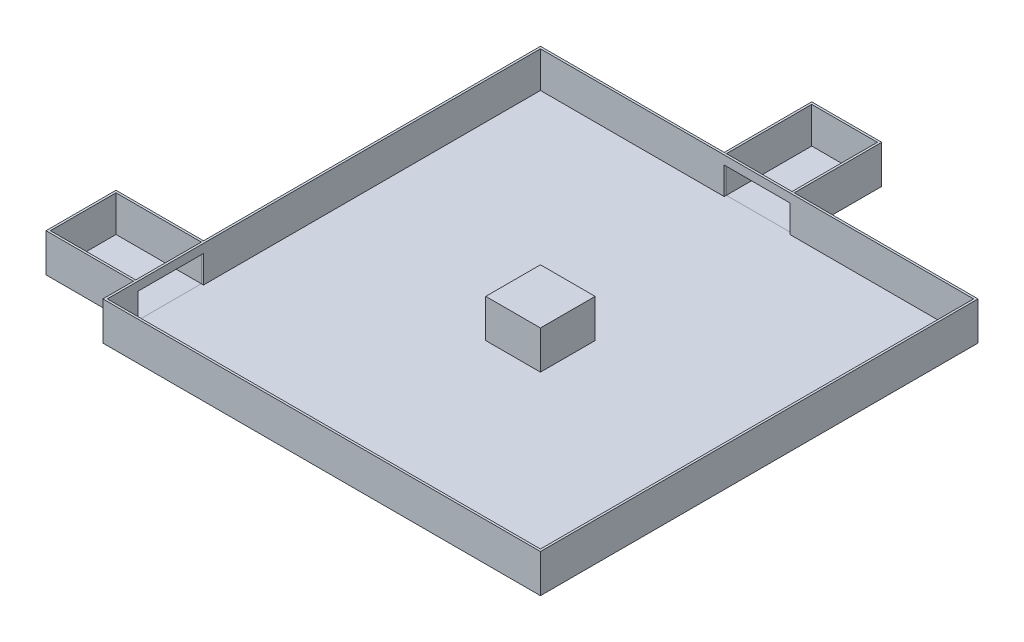
ISO-10303-21;
HEADER;
FILE_DESCRIPTION(('STEP AP214'),'2;1');
FILE_NAME('part.step','',(''),(''),'','','');
FILE_SCHEMA(('AUTOMOTIVE_DESIGN { 1 0 10303 214 1 1 1 1 }'));
ENDSEC;
DATA;
#1=APPLICATION_CONTEXT('core data for automotive mechanical design processes');
#2=APPLICATION_PROTOCOL_DEFINITION('international standard','automotive_design',2000,#1);
#3=PRODUCT_CONTEXT('',#1,'mechanical');
#4=PRODUCT('Part','Part','',(#3));
#5=PRODUCT_RELATED_PRODUCT_CATEGORY('part','',(#4));
#6=PRODUCT_DEFINITION_FORMATION('','',#4);
#7=PRODUCT_DEFINITION_CONTEXT('part definition',#1,'design');
#8=PRODUCT_DEFINITION('design','',#6,#7);
#9=PRODUCT_DEFINITION_SHAPE('','',#8);
#10=(LENGTH_UNIT() NAMED_UNIT(*) SI_UNIT(.MILLI.,.METRE.));
#11=(NAMED_UNIT(*) PLANE_ANGLE_UNIT() SI_UNIT($,.RADIAN.));
#12=(NAMED_UNIT(*) SI_UNIT($,.STERADIAN.) SOLID_ANGLE_UNIT());
#13=UNCERTAINTY_MEASURE_WITH_UNIT(LENGTH_MEASURE(1.E-05),#10,'distance_accuracy_value','');
#14=(GEOMETRIC_REPRESENTATION_CONTEXT(3) GLOBAL_UNCERTAINTY_ASSIGNED_CONTEXT((#13)) GLOBAL_UNIT_ASSIGNED_CONTEXT((#10,
#11,#12)) REPRESENTATION_CONTEXT('',''));
#15=CARTESIAN_POINT('',(0.,0.,0.));
#16=DIRECTION('',(0.,0.,1.));
#17=DIRECTION('',(1.,0.,0.));
#18=AXIS2_PLACEMENT_3D('',#15,#16,#17);
#19=CARTESIAN_POINT('',(0.,350.,-280.));
#20=DIRECTION('',(1.,0.,0.));
#21=DIRECTION('',(0.,0.,-1.));
#22=AXIS2_PLACEMENT_3D('',#19,#20,#21);
#23=PLANE('',#22);
#24=DIRECTION('',(0.,1.,0.));
#25=VECTOR('',#24,1.);
#26=CARTESIAN_POINT('',(0.,20.,-900.));
#27=LINE('',#26,#25);
#28=CARTESIAN_POINT('',(0.,20.,-900.));
#29=VERTEX_POINT('',#28);
#30=CARTESIAN_POINT('',(0.,350.,-900.));
#31=VERTEX_POINT('',#30);
#32=EDGE_CURVE('E123',#29,#31,#27,.T.);
#33=ORIENTED_EDGE('',*,*,#32,.F.);
#34=DIRECTION('',(0.,0.,-1.));
#35=VECTOR('',#34,1.);
#36=CARTESIAN_POINT('',(0.,20.,-900.));
#37=LINE('',#36,#35);
#38=CARTESIAN_POINT('',(0.,20.,-300.));
#39=VERTEX_POINT('',#38);
#40=EDGE_CURVE('E172',#39,#29,#37,.T.);
#41=ORIENTED_EDGE('',*,*,#40,.F.);
#42=DIRECTION('',(0.,1.,0.));
#43=VECTOR('',#42,1.);
#44=CARTESIAN_POINT('',(0.,20.,-300.));
#45=LINE('',#44,#43);
#46=CARTESIAN_POINT('',(0.,350.,-300.));
#47=VERTEX_POINT('',#46);
#48=EDGE_CURVE('E130',#39,#47,#45,.T.);
#49=ORIENTED_EDGE('',*,*,#48,.T.);
#50=DIRECTION('',(0.,0.,1.));
#51=VECTOR('',#50,1.);
#52=CARTESIAN_POINT('',(0.,350.,-280.));
#53=LINE('',#52,#51);
#54=CARTESIAN_POINT('',(0.,350.,-280.));
#55=VERTEX_POINT('',#54);
#56=EDGE_CURVE('E96',#47,#55,#53,.T.);
#57=ORIENTED_EDGE('',*,*,#56,.T.);
#58=DIRECTION('',(0.,-1.,0.));
#59=VECTOR('',#58,1.);
#60=CARTESIAN_POINT('',(0.,350.,-280.));
#61=LINE('',#60,#59);
#62=CARTESIAN_POINT('',(0.,0.,-280.));
#63=VERTEX_POINT('',#62);
#64=EDGE_CURVE('E76',#55,#63,#61,.T.);
#65=ORIENTED_EDGE('',*,*,#64,.T.);
#66=DIRECTION('',(0.,0.,1.));
#67=VECTOR('',#66,1.);
#68=CARTESIAN_POINT('',(0.,0.,-280.));
#69=LINE('',#68,#67);
#70=CARTESIAN_POINT('',(0.,0.,-919.999999999999));
#71=VERTEX_POINT('',#70);
#72=EDGE_CURVE('E12',#71,#63,#69,.T.);
#73=ORIENTED_EDGE('',*,*,#72,.F.);
#74=DIRECTION('',(0.,-1.,0.));
#75=VECTOR('',#74,1.);
#76=CARTESIAN_POINT('',(0.,350.,-919.999999999999));
#77=LINE('',#76,#75);
#78=CARTESIAN_POINT('',(0.,350.,-919.999999999999));
#79=VERTEX_POINT('',#78);
#80=EDGE_CURVE('E102',#79,#71,#77,.T.);
#81=ORIENTED_EDGE('',*,*,#80,.F.);
#82=EDGE_CURVE('E54',#79,#31,#53,.T.);
#83=ORIENTED_EDGE('',*,*,#82,.T.);
#84=EDGE_LOOP('',(#33,#41,#49,#57,#65,#73,#81,#83));
#85=FACE_BOUND('',#84,.T.);
#86=ADVANCED_FACE('F50',(#85),#23,.T.);
#87=CARTESIAN_POINT('',(0.,350.,-919.999999999999));
#88=DIRECTION('',(0.,0.,-1.));
#89=DIRECTION('',(-1.,0.,0.));
#90=AXIS2_PLACEMENT_3D('',#87,#88,#89);
#91=PLANE('',#90);
#92=DIRECTION('',(1.,0.,0.));
#93=VECTOR('',#92,1.);
#94=CARTESIAN_POINT('',(0.,0.,-919.999999999999));
#95=LINE('',#94,#93);
#96=CARTESIAN_POINT('',(-800.,0.,-920.));
#97=VERTEX_POINT('',#96);
#98=EDGE_CURVE('E140',#97,#71,#95,.T.);
#99=ORIENTED_EDGE('',*,*,#98,.F.);
#100=DIRECTION('',(0.,-1.,0.));
#101=VECTOR('',#100,1.);
#102=CARTESIAN_POINT('',(-800.,350.,-920.));
#103=LINE('',#102,#101);
#104=CARTESIAN_POINT('',(-800.,350.,-920.));
#105=VERTEX_POINT('',#104);
#106=EDGE_CURVE('E159',#105,#97,#103,.T.);
#107=ORIENTED_EDGE('',*,*,#106,.F.);
#108=DIRECTION('',(1.,0.,0.));
#109=VECTOR('',#108,1.);
#110=CARTESIAN_POINT('',(0.,350.,-919.999999999999));
#111=LINE('',#110,#109);
#112=EDGE_CURVE('E150',#105,#79,#111,.T.);
#113=ORIENTED_EDGE('',*,*,#112,.T.);
#114=ORIENTED_EDGE('',*,*,#80,.T.);
#115=EDGE_LOOP('',(#99,#107,#113,#114));
#116=FACE_BOUND('',#115,.T.);
#117=ADVANCED_FACE('F194',(#116),#91,.T.);
#118=CARTESIAN_POINT('',(-800.,350.,-920.));
#119=DIRECTION('',(-1.,0.,0.));
#120=DIRECTION('',(0.,0.,1.));
#121=AXIS2_PLACEMENT_3D('',#118,#119,#120);
#122=PLANE('',#121);
#123=DIRECTION('',(0.,0.,-1.));
#124=VECTOR('',#123,1.);
#125=CARTESIAN_POINT('',(-800.,0.,-920.));
#126=LINE('',#125,#124);
#127=CARTESIAN_POINT('',(-800.,0.,-280.));
#128=VERTEX_POINT('',#127);
#129=EDGE_CURVE('E142',#128,#97,#126,.T.);
#130=ORIENTED_EDGE('',*,*,#129,.F.);
#131=DIRECTION('',(0.,-1.,0.));
#132=VECTOR('',#131,1.);
#133=CARTESIAN_POINT('',(-800.,350.,-280.));
#134=LINE('',#133,#132);
#135=CARTESIAN_POINT('',(-800.,350.,-280.));
#136=VERTEX_POINT('',#135);
#137=EDGE_CURVE('E161',#136,#128,#134,.T.);
#138=ORIENTED_EDGE('',*,*,#137,.F.);
#139=DIRECTION('',(0.,0.,-1.));
#140=VECTOR('',#139,1.);
#141=CARTESIAN_POINT('',(-800.,350.,-920.));
#142=LINE('',#141,#140);
#143=EDGE_CURVE('E146',#136,#105,#142,.T.);
#144=ORIENTED_EDGE('',*,*,#143,.T.);
#145=ORIENTED_EDGE('',*,*,#106,.T.);
#146=EDGE_LOOP('',(#130,#138,#144,#145));
#147=FACE_BOUND('',#146,.T.);
#148=ADVANCED_FACE('F190',(#147),#122,.T.);
#149=CARTESIAN_POINT('',(-800.,350.,-280.));
#150=DIRECTION('',(0.,0.,1.));
#151=DIRECTION('',(1.,0.,0.));
#152=AXIS2_PLACEMENT_3D('',#149,#150,#151);
#153=PLANE('',#152);
#154=DIRECTION('',(-1.,0.,0.));
#155=VECTOR('',#154,1.);
#156=CARTESIAN_POINT('',(-800.,0.,-280.));
#157=LINE('',#156,#155);
#158=EDGE_CURVE('E59',#63,#128,#157,.T.);
#159=ORIENTED_EDGE('',*,*,#158,.F.);
#160=ORIENTED_EDGE('',*,*,#64,.F.);
#161=DIRECTION('',(-1.,0.,0.));
#162=VECTOR('',#161,1.);
#163=CARTESIAN_POINT('',(-800.,350.,-280.));
#164=LINE('',#163,#162);
#165=EDGE_CURVE('E144',#55,#136,#164,.T.);
#166=ORIENTED_EDGE('',*,*,#165,.T.);
#167=ORIENTED_EDGE('',*,*,#137,.T.);
#168=EDGE_LOOP('',(#159,#160,#166,#167));
#169=FACE_BOUND('',#168,.T.);
#170=ADVANCED_FACE('F191',(#169),#153,.T.);
#171=CARTESIAN_POINT('',(0.,350.,0.));
#172=DIRECTION('',(0.,1.,0.));
#173=DIRECTION('',(0.,0.,1.));
#174=AXIS2_PLACEMENT_3D('',#171,#172,#173);
#175=PLANE('',#174);
#176=DIRECTION('',(-1.,0.,0.));
#177=VECTOR('',#176,1.);
#178=CARTESIAN_POINT('',(-780.,350.,-900.));
#179=LINE('',#178,#177);
#180=CARTESIAN_POINT('',(-780.,350.,-900.));
#181=VERTEX_POINT('',#180);
#182=EDGE_CURVE('E67',#31,#181,#179,.T.);
#183=ORIENTED_EDGE('',*,*,#182,.F.);
#184=ORIENTED_EDGE('',*,*,#82,.F.);
#185=ORIENTED_EDGE('',*,*,#112,.F.);
#186=ORIENTED_EDGE('',*,*,#143,.F.);
#187=ORIENTED_EDGE('',*,*,#165,.F.);
#188=ORIENTED_EDGE('',*,*,#56,.F.);
#189=DIRECTION('',(1.,0.,0.));
#190=VECTOR('',#189,1.);
#191=CARTESIAN_POINT('',(0.,350.,-300.));
#192=LINE('',#191,#190);
#193=CARTESIAN_POINT('',(-780.,350.,-299.999999999999));
#194=VERTEX_POINT('',#193);
#195=EDGE_CURVE('E165',#194,#47,#192,.T.);
#196=ORIENTED_EDGE('',*,*,#195,.F.);
#197=DIRECTION('',(0.,0.,1.));
#198=VECTOR('',#197,1.);
#199=CARTESIAN_POINT('',(-780.,350.,-299.999999999999));
#200=LINE('',#199,#198);
#201=EDGE_CURVE('E138',#181,#194,#200,.T.);
#202=ORIENTED_EDGE('',*,*,#201,.F.);
#203=EDGE_LOOP('',(#183,#184,#185,#186,#187,#188,#196,#202));
#204=FACE_BOUND('',#203,.T.);
#205=ADVANCED_FACE('F52',(#204),#175,.T.);
#206=CARTESIAN_POINT('',(0.,0.,0.));
#207=DIRECTION('',(0.,1.,0.));
#208=DIRECTION('',(0.,0.,1.));
#209=AXIS2_PLACEMENT_3D('',#206,#207,#208);
#210=PLANE('',#209);
#211=ORIENTED_EDGE('',*,*,#72,.T.);
#212=ORIENTED_EDGE('',*,*,#158,.T.);
#213=ORIENTED_EDGE('',*,*,#129,.T.);
#214=ORIENTED_EDGE('',*,*,#98,.T.);
#215=EDGE_LOOP('',(#211,#212,#213,#214));
#216=FACE_BOUND('',#215,.T.);
#217=ADVANCED_FACE('F193',(#216),#210,.F.);
#218=CARTESIAN_POINT('',(-780.,20.,-900.));
#219=DIRECTION('',(0.,0.,-1.));
#220=DIRECTION('',(-1.,0.,0.));
#221=AXIS2_PLACEMENT_3D('',#218,#219,#220);
#222=PLANE('',#221);
#223=ORIENTED_EDGE('',*,*,#182,.T.);
#224=DIRECTION('',(0.,1.,0.));
#225=VECTOR('',#224,1.);
#226=CARTESIAN_POINT('',(-780.,20.,-900.));
#227=LINE('',#226,#225);
#228=CARTESIAN_POINT('',(-780.,20.,-900.));
#229=VERTEX_POINT('',#228);
#230=EDGE_CURVE('E173',#229,#181,#227,.T.);
#231=ORIENTED_EDGE('',*,*,#230,.F.);
#232=DIRECTION('',(-1.,0.,0.));
#233=VECTOR('',#232,1.);
#234=CARTESIAN_POINT('',(-780.,20.,-900.));
#235=LINE('',#234,#233);
#236=EDGE_CURVE('E126',#29,#229,#235,.T.);
#237=ORIENTED_EDGE('',*,*,#236,.F.);
#238=ORIENTED_EDGE('',*,*,#32,.T.);
#239=EDGE_LOOP('',(#223,#231,#237,#238));
#240=FACE_BOUND('',#239,.T.);
#241=ADVANCED_FACE('F124',(#240),#222,.F.);
#242=CARTESIAN_POINT('',(0.,20.,-300.));
#243=DIRECTION('',(0.,0.,1.));
#244=DIRECTION('',(1.,0.,0.));
#245=AXIS2_PLACEMENT_3D('',#242,#243,#244);
#246=PLANE('',#245);
#247=ORIENTED_EDGE('',*,*,#195,.T.);
#248=ORIENTED_EDGE('',*,*,#48,.F.);
#249=DIRECTION('',(1.,0.,0.));
#250=VECTOR('',#249,1.);
#251=CARTESIAN_POINT('',(0.,20.,-300.));
#252=LINE('',#251,#250);
#253=CARTESIAN_POINT('',(-780.,20.,-299.999999999999));
#254=VERTEX_POINT('',#253);
#255=EDGE_CURVE('E169',#254,#39,#252,.T.);
#256=ORIENTED_EDGE('',*,*,#255,.F.);
#257=DIRECTION('',(0.,1.,0.));
#258=VECTOR('',#257,1.);
#259=CARTESIAN_POINT('',(-780.,20.,-299.999999999999));
#260=LINE('',#259,#258);
#261=EDGE_CURVE('E178',#254,#194,#260,.T.);
#262=ORIENTED_EDGE('',*,*,#261,.T.);
#263=EDGE_LOOP('',(#247,#248,#256,#262));
#264=FACE_BOUND('',#263,.T.);
#265=ADVANCED_FACE('F209',(#264),#246,.F.);
#266=CARTESIAN_POINT('',(-780.,20.,-299.999999999999));
#267=DIRECTION('',(-1.,0.,0.));
#268=DIRECTION('',(0.,0.,1.));
#269=AXIS2_PLACEMENT_3D('',#266,#267,#268);
#270=PLANE('',#269);
#271=ORIENTED_EDGE('',*,*,#201,.T.);
#272=ORIENTED_EDGE('',*,*,#261,.F.);
#273=DIRECTION('',(0.,0.,1.));
#274=VECTOR('',#273,1.);
#275=CARTESIAN_POINT('',(-780.,20.,-299.999999999999));
#276=LINE('',#275,#274);
#277=EDGE_CURVE('E166',#229,#254,#276,.T.);
#278=ORIENTED_EDGE('',*,*,#277,.F.);
#279=ORIENTED_EDGE('',*,*,#230,.T.);
#280=EDGE_LOOP('',(#271,#272,#278,#279));
#281=FACE_BOUND('',#280,.T.);
#282=ADVANCED_FACE('F182',(#281),#270,.F.);
#283=CARTESIAN_POINT('',(0.,20.,0.));
#284=DIRECTION('',(0.,-1.,0.));
#285=DIRECTION('',(0.,0.,-1.));
#286=AXIS2_PLACEMENT_3D('',#283,#284,#285);
#287=PLANE('',#286);
#288=ORIENTED_EDGE('',*,*,#236,.T.);
#289=ORIENTED_EDGE('',*,*,#277,.T.);
#290=ORIENTED_EDGE('',*,*,#255,.T.);
#291=ORIENTED_EDGE('',*,*,#40,.T.);
#292=EDGE_LOOP('',(#288,#289,#290,#291));
#293=FACE_BOUND('',#292,.T.);
#294=ADVANCED_FACE('F185',(#293),#287,.F.);
#295=CLOSED_SHELL('',(#86,#117,#148,#170,#205,#217,#241,#265,#282,#294));
#296=MANIFOLD_SOLID_BREP('B2',#295);
#297=CARTESIAN_POINT('',(1680.,350.,-4000.));
#298=DIRECTION('',(0.,0.,1.));
#299=DIRECTION('',(1.,0.,0.));
#300=AXIS2_PLACEMENT_3D('',#297,#298,#299);
#301=PLANE('',#300);
#302=DIRECTION('',(0.,1.,0.));
#303=VECTOR('',#302,1.);
#304=CARTESIAN_POINT('',(2300.,20.,-4000.));
#305=LINE('',#304,#303);
#306=CARTESIAN_POINT('',(2300.,20.,-4000.));
#307=VERTEX_POINT('',#306);
#308=CARTESIAN_POINT('',(2300.,350.,-4000.));
#309=VERTEX_POINT('',#308);
#310=EDGE_CURVE('E387',#307,#309,#305,.T.);
#311=ORIENTED_EDGE('',*,*,#310,.F.);
#312=DIRECTION('',(1.,0.,0.));
#313=VECTOR('',#312,1.);
#314=CARTESIAN_POINT('',(2300.,20.,-4000.));
#315=LINE('',#314,#313);
#316=CARTESIAN_POINT('',(1700.,20.,-4000.));
#317=VERTEX_POINT('',#316);
#318=EDGE_CURVE('E365',#317,#307,#315,.T.);
#319=ORIENTED_EDGE('',*,*,#318,.F.);
#320=DIRECTION('',(0.,1.,0.));
#321=VECTOR('',#320,1.);
#322=CARTESIAN_POINT('',(1700.,20.,-4000.));
#323=LINE('',#322,#321);
#324=CARTESIAN_POINT('',(1700.,350.,-4000.));
#325=VERTEX_POINT('',#324);
#326=EDGE_CURVE('E390',#317,#325,#323,.T.);
#327=ORIENTED_EDGE('',*,*,#326,.T.);
#328=DIRECTION('',(-1.,0.,0.));
#329=VECTOR('',#328,1.);
#330=CARTESIAN_POINT('',(1680.,350.,-4000.));
#331=LINE('',#330,#329);
#332=CARTESIAN_POINT('',(1680.,350.,-4000.));
#333=VERTEX_POINT('',#332);
#334=EDGE_CURVE('E334',#325,#333,#331,.T.);
#335=ORIENTED_EDGE('',*,*,#334,.T.);
#336=DIRECTION('',(0.,-1.,0.));
#337=VECTOR('',#336,1.);
#338=CARTESIAN_POINT('',(1680.,350.,-4000.));
#339=LINE('',#338,#337);
#340=CARTESIAN_POINT('',(1680.,0.,-4000.));
#341=VERTEX_POINT('',#340);
#342=EDGE_CURVE('E289',#333,#341,#339,.T.);
#343=ORIENTED_EDGE('',*,*,#342,.T.);
#344=DIRECTION('',(-1.,0.,0.));
#345=VECTOR('',#344,1.);
#346=CARTESIAN_POINT('',(1680.,0.,-4000.));
#347=LINE('',#346,#345);
#348=CARTESIAN_POINT('',(2320.,0.,-4000.));
#349=VERTEX_POINT('',#348);
#350=EDGE_CURVE('E389',#349,#341,#347,.T.);
#351=ORIENTED_EDGE('',*,*,#350,.F.);
#352=DIRECTION('',(0.,-1.,0.));
#353=VECTOR('',#352,1.);
#354=CARTESIAN_POINT('',(2320.,350.,-4000.));
#355=LINE('',#354,#353);
#356=CARTESIAN_POINT('',(2320.,350.,-4000.));
#357=VERTEX_POINT('',#356);
#358=EDGE_CURVE('E48',#357,#349,#355,.T.);
#359=ORIENTED_EDGE('',*,*,#358,.F.);
#360=EDGE_CURVE('E393',#357,#309,#331,.T.);
#361=ORIENTED_EDGE('',*,*,#360,.T.);
#362=EDGE_LOOP('',(#311,#319,#327,#335,#343,#351,#359,#361));
#363=FACE_BOUND('',#362,.T.);
#364=ADVANCED_FACE('F286',(#363),#301,.T.);
#365=CARTESIAN_POINT('',(2320.,350.,-4000.));
#366=DIRECTION('',(1.,0.,0.));
#367=DIRECTION('',(0.,0.,-1.));
#368=AXIS2_PLACEMENT_3D('',#365,#366,#367);
#369=PLANE('',#368);
#370=DIRECTION('',(0.,0.,1.));
#371=VECTOR('',#370,1.);
#372=CARTESIAN_POINT('',(2320.,0.,-4000.));
#373=LINE('',#372,#371);
#374=CARTESIAN_POINT('',(2320.,0.,-4800.));
#375=VERTEX_POINT('',#374);
#376=EDGE_CURVE('E411',#375,#349,#373,.T.);
#377=ORIENTED_EDGE('',*,*,#376,.F.);
#378=DIRECTION('',(0.,-1.,0.));
#379=VECTOR('',#378,1.);
#380=CARTESIAN_POINT('',(2320.,350.,-4800.));
#381=LINE('',#380,#379);
#382=CARTESIAN_POINT('',(2320.,350.,-4800.));
#383=VERTEX_POINT('',#382);
#384=EDGE_CURVE('E294',#383,#375,#381,.T.);
#385=ORIENTED_EDGE('',*,*,#384,.F.);
#386=DIRECTION('',(0.,0.,1.));
#387=VECTOR('',#386,1.);
#388=CARTESIAN_POINT('',(2320.,350.,-4000.));
#389=LINE('',#388,#387);
#390=EDGE_CURVE('E401',#383,#357,#389,.T.);
#391=ORIENTED_EDGE('',*,*,#390,.T.);
#392=ORIENTED_EDGE('',*,*,#358,.T.);
#393=EDGE_LOOP('',(#377,#385,#391,#392));
#394=FACE_BOUND('',#393,.T.);
#395=ADVANCED_FACE('F422',(#394),#369,.T.);
#396=CARTESIAN_POINT('',(2320.,350.,-4800.));
#397=DIRECTION('',(0.,0.,-1.));
#398=DIRECTION('',(-1.,0.,0.));
#399=AXIS2_PLACEMENT_3D('',#396,#397,#398);
#400=PLANE('',#399);
#401=DIRECTION('',(1.,0.,0.));
#402=VECTOR('',#401,1.);
#403=CARTESIAN_POINT('',(2320.,0.,-4800.));
#404=LINE('',#403,#402);
#405=CARTESIAN_POINT('',(1680.,0.,-4800.));
#406=VERTEX_POINT('',#405);
#407=EDGE_CURVE('E408',#406,#375,#404,.T.);
#408=ORIENTED_EDGE('',*,*,#407,.F.);
#409=DIRECTION('',(0.,-1.,0.));
#410=VECTOR('',#409,1.);
#411=CARTESIAN_POINT('',(1680.,350.,-4800.));
#412=LINE('',#411,#410);
#413=CARTESIAN_POINT('',(1680.,350.,-4800.));
#414=VERTEX_POINT('',#413);
#415=EDGE_CURVE('E414',#414,#406,#412,.T.);
#416=ORIENTED_EDGE('',*,*,#415,.F.);
#417=DIRECTION('',(1.,0.,0.));
#418=VECTOR('',#417,1.);
#419=CARTESIAN_POINT('',(2320.,350.,-4800.));
#420=LINE('',#419,#418);
#421=EDGE_CURVE('E398',#414,#383,#420,.T.);
#422=ORIENTED_EDGE('',*,*,#421,.T.);
#423=ORIENTED_EDGE('',*,*,#384,.T.);
#424=EDGE_LOOP('',(#408,#416,#422,#423));
#425=FACE_BOUND('',#424,.T.);
#426=ADVANCED_FACE('F426',(#425),#400,.T.);
#427=CARTESIAN_POINT('',(1680.,350.,-4800.));
#428=DIRECTION('',(-1.,0.,0.));
#429=DIRECTION('',(0.,0.,1.));
#430=AXIS2_PLACEMENT_3D('',#427,#428,#429);
#431=PLANE('',#430);
#432=DIRECTION('',(0.,0.,-1.));
#433=VECTOR('',#432,1.);
#434=CARTESIAN_POINT('',(1680.,0.,-4800.));
#435=LINE('',#434,#433);
#436=EDGE_CURVE('E405',#341,#406,#435,.T.);
#437=ORIENTED_EDGE('',*,*,#436,.F.);
#438=ORIENTED_EDGE('',*,*,#342,.F.);
#439=DIRECTION('',(0.,0.,-1.));
#440=VECTOR('',#439,1.);
#441=CARTESIAN_POINT('',(1680.,350.,-4800.));
#442=LINE('',#441,#440);
#443=EDGE_CURVE('E395',#333,#414,#442,.T.);
#444=ORIENTED_EDGE('',*,*,#443,.T.);
#445=ORIENTED_EDGE('',*,*,#415,.T.);
#446=EDGE_LOOP('',(#437,#438,#444,#445));
#447=FACE_BOUND('',#446,.T.);
#448=ADVANCED_FACE('F419',(#447),#431,.T.);
#449=CARTESIAN_POINT('',(0.,350.,0.));
#450=DIRECTION('',(0.,1.,0.));
#451=DIRECTION('',(0.,0.,1.));
#452=AXIS2_PLACEMENT_3D('',#449,#450,#451);
#453=PLANE('',#452);
#454=DIRECTION('',(0.,0.,-1.));
#455=VECTOR('',#454,1.);
#456=CARTESIAN_POINT('',(2300.,350.,-4780.));
#457=LINE('',#456,#455);
#458=CARTESIAN_POINT('',(2300.,350.,-4780.));
#459=VERTEX_POINT('',#458);
#460=EDGE_CURVE('E302',#309,#459,#457,.T.);
#461=ORIENTED_EDGE('',*,*,#460,.F.);
#462=ORIENTED_EDGE('',*,*,#360,.F.);
#463=ORIENTED_EDGE('',*,*,#390,.F.);
#464=ORIENTED_EDGE('',*,*,#421,.F.);
#465=ORIENTED_EDGE('',*,*,#443,.F.);
#466=ORIENTED_EDGE('',*,*,#334,.F.);
#467=DIRECTION('',(0.,0.,1.));
#468=VECTOR('',#467,1.);
#469=CARTESIAN_POINT('',(1700.,350.,-4000.));
#470=LINE('',#469,#468);
#471=CARTESIAN_POINT('',(1700.,350.,-4780.));
#472=VERTEX_POINT('',#471);
#473=EDGE_CURVE('E378',#472,#325,#470,.T.);
#474=ORIENTED_EDGE('',*,*,#473,.F.);
#475=DIRECTION('',(-1.,0.,0.));
#476=VECTOR('',#475,1.);
#477=CARTESIAN_POINT('',(1700.,350.,-4780.));
#478=LINE('',#477,#476);
#479=EDGE_CURVE('E380',#459,#472,#478,.T.);
#480=ORIENTED_EDGE('',*,*,#479,.F.);
#481=EDGE_LOOP('',(#461,#462,#463,#464,#465,#466,#474,#480));
#482=FACE_BOUND('',#481,.T.);
#483=ADVANCED_FACE('F428',(#482),#453,.T.);
#484=CARTESIAN_POINT('',(0.,0.,0.));
#485=DIRECTION('',(0.,1.,0.));
#486=DIRECTION('',(0.,0.,1.));
#487=AXIS2_PLACEMENT_3D('',#484,#485,#486);
#488=PLANE('',#487);
#489=ORIENTED_EDGE('',*,*,#350,.T.);
#490=ORIENTED_EDGE('',*,*,#436,.T.);
#491=ORIENTED_EDGE('',*,*,#407,.T.);
#492=ORIENTED_EDGE('',*,*,#376,.T.);
#493=EDGE_LOOP('',(#489,#490,#491,#492));
#494=FACE_BOUND('',#493,.T.);
#495=ADVANCED_FACE('F421',(#494),#488,.F.);
#496=CARTESIAN_POINT('',(2300.,20.,-4780.));
#497=DIRECTION('',(1.,0.,0.));
#498=DIRECTION('',(0.,0.,-1.));
#499=AXIS2_PLACEMENT_3D('',#496,#497,#498);
#500=PLANE('',#499);
#501=ORIENTED_EDGE('',*,*,#460,.T.);
#502=DIRECTION('',(0.,1.,0.));
#503=VECTOR('',#502,1.);
#504=CARTESIAN_POINT('',(2300.,20.,-4780.));
#505=LINE('',#504,#503);
#506=CARTESIAN_POINT('',(2300.,20.,-4780.));
#507=VERTEX_POINT('',#506);
#508=EDGE_CURVE('E355',#507,#459,#505,.T.);
#509=ORIENTED_EDGE('',*,*,#508,.F.);
#510=DIRECTION('',(0.,0.,-1.));
#511=VECTOR('',#510,1.);
#512=CARTESIAN_POINT('',(2300.,20.,-4780.));
#513=LINE('',#512,#511);
#514=EDGE_CURVE('E359',#307,#507,#513,.T.);
#515=ORIENTED_EDGE('',*,*,#514,.F.);
#516=ORIENTED_EDGE('',*,*,#310,.T.);
#517=EDGE_LOOP('',(#501,#509,#515,#516));
#518=FACE_BOUND('',#517,.T.);
#519=ADVANCED_FACE('F357',(#518),#500,.F.);
#520=CARTESIAN_POINT('',(1700.,20.,-4000.));
#521=DIRECTION('',(-1.,0.,0.));
#522=DIRECTION('',(0.,0.,1.));
#523=AXIS2_PLACEMENT_3D('',#520,#521,#522);
#524=PLANE('',#523);
#525=ORIENTED_EDGE('',*,*,#473,.T.);
#526=ORIENTED_EDGE('',*,*,#326,.F.);
#527=DIRECTION('',(0.,0.,1.));
#528=VECTOR('',#527,1.);
#529=CARTESIAN_POINT('',(1700.,20.,-4000.));
#530=LINE('',#529,#528);
#531=CARTESIAN_POINT('',(1700.,20.,-4780.));
#532=VERTEX_POINT('',#531);
#533=EDGE_CURVE('E373',#532,#317,#530,.T.);
#534=ORIENTED_EDGE('',*,*,#533,.F.);
#535=DIRECTION('',(0.,1.,0.));
#536=VECTOR('',#535,1.);
#537=CARTESIAN_POINT('',(1700.,20.,-4780.));
#538=LINE('',#537,#536);
#539=EDGE_CURVE('E364',#532,#472,#538,.T.);
#540=ORIENTED_EDGE('',*,*,#539,.T.);
#541=EDGE_LOOP('',(#525,#526,#534,#540));
#542=FACE_BOUND('',#541,.T.);
#543=ADVANCED_FACE('F431',(#542),#524,.F.);
#544=CARTESIAN_POINT('',(1700.,20.,-4780.));
#545=DIRECTION('',(0.,0.,-1.));
#546=DIRECTION('',(-1.,0.,0.));
#547=AXIS2_PLACEMENT_3D('',#544,#545,#546);
#548=PLANE('',#547);
#549=ORIENTED_EDGE('',*,*,#479,.T.);
#550=ORIENTED_EDGE('',*,*,#539,.F.);
#551=DIRECTION('',(-1.,0.,0.));
#552=VECTOR('',#551,1.);
#553=CARTESIAN_POINT('',(1700.,20.,-4780.));
#554=LINE('',#553,#552);
#555=EDGE_CURVE('E368',#507,#532,#554,.T.);
#556=ORIENTED_EDGE('',*,*,#555,.F.);
#557=ORIENTED_EDGE('',*,*,#508,.T.);
#558=EDGE_LOOP('',(#549,#550,#556,#557));
#559=FACE_BOUND('',#558,.T.);
#560=ADVANCED_FACE('F369',(#559),#548,.F.);
#561=CARTESIAN_POINT('',(0.,20.,0.));
#562=DIRECTION('',(0.,-1.,0.));
#563=DIRECTION('',(0.,0.,-1.));
#564=AXIS2_PLACEMENT_3D('',#561,#562,#563);
#565=PLANE('',#564);
#566=ORIENTED_EDGE('',*,*,#514,.T.);
#567=ORIENTED_EDGE('',*,*,#555,.T.);
#568=ORIENTED_EDGE('',*,*,#533,.T.);
#569=ORIENTED_EDGE('',*,*,#318,.T.);
#570=EDGE_LOOP('',(#566,#567,#568,#569));
#571=FACE_BOUND('',#570,.T.);
#572=ADVANCED_FACE('F375',(#571),#565,.F.);
#573=CLOSED_SHELL('',(#364,#395,#426,#448,#483,#495,#519,#543,#560,#572));
#574=MANIFOLD_SOLID_BREP('B6',#573);
#575=CARTESIAN_POINT('',(0.,20.,0.));
#576=DIRECTION('',(0.,-1.,0.));
#577=DIRECTION('',(0.,0.,-1.));
#578=AXIS2_PLACEMENT_3D('',#575,#576,#577);
#579=PLANE('',#578);
#580=DIRECTION('',(0.,0.,1.));
#581=VECTOR('',#580,1.);
#582=CARTESIAN_POINT('',(20.,20.,-20.));
#583=LINE('',#582,#581);
#584=CARTESIAN_POINT('',(20.,20.,-3980.));
#585=VERTEX_POINT('',#584);
#586=CARTESIAN_POINT('',(20.,19.9999999999998,-900.));
#587=VERTEX_POINT('',#586);
#588=EDGE_CURVE('E736',#585,#587,#583,.T.);
#589=ORIENTED_EDGE('',*,*,#588,.T.);
#590=DIRECTION('',(-1.,0.,0.));
#591=VECTOR('',#590,1.);
#592=CARTESIAN_POINT('',(20.,19.9999999999998,-900.));
#593=LINE('',#592,#591);
#594=CARTESIAN_POINT('',(0.,19.9999999999998,-900.));
#595=VERTEX_POINT('',#594);
#596=EDGE_CURVE('E689',#587,#595,#593,.T.);
#597=ORIENTED_EDGE('',*,*,#596,.T.);
#598=DIRECTION('',(0.,0.,1.));
#599=VECTOR('',#598,1.);
#600=CARTESIAN_POINT('',(0.,19.9999999999997,-300.));
#601=LINE('',#600,#599);
#602=CARTESIAN_POINT('',(0.,19.9999999999997,-300.));
#603=VERTEX_POINT('',#602);
#604=EDGE_CURVE('E674',#595,#603,#601,.T.);
#605=ORIENTED_EDGE('',*,*,#604,.T.);
#606=DIRECTION('',(-1.,0.,0.));
#607=VECTOR('',#606,1.);
#608=CARTESIAN_POINT('',(20.,19.9999999999997,-300.));
#609=LINE('',#608,#607);
#610=CARTESIAN_POINT('',(20.,20.,-300.));
#611=VERTEX_POINT('',#610);
#612=EDGE_CURVE('E703',#611,#603,#609,.T.);
#613=ORIENTED_EDGE('',*,*,#612,.F.);
#614=CARTESIAN_POINT('',(20.,20.,-20.));
#615=VERTEX_POINT('',#614);
#616=EDGE_CURVE('E740',#611,#615,#583,.T.);
#617=ORIENTED_EDGE('',*,*,#616,.T.);
#618=DIRECTION('',(1.,0.,0.));
#619=VECTOR('',#618,1.);
#620=CARTESIAN_POINT('',(3980.,20.,-20.0000000000001));
#621=LINE('',#620,#619);
#622=CARTESIAN_POINT('',(3980.,20.,-20.0000000000001));
#623=VERTEX_POINT('',#622);
#624=EDGE_CURVE('E739',#615,#623,#621,.T.);
#625=ORIENTED_EDGE('',*,*,#624,.T.);
#626=DIRECTION('',(0.,0.,-1.));
#627=VECTOR('',#626,1.);
#628=CARTESIAN_POINT('',(3980.,20.,-3980.));
#629=LINE('',#628,#627);
#630=CARTESIAN_POINT('',(3980.,20.,-3980.));
#631=VERTEX_POINT('',#630);
#632=EDGE_CURVE('E743',#623,#631,#629,.T.);
#633=ORIENTED_EDGE('',*,*,#632,.T.);
#634=DIRECTION('',(-1.,0.,0.));
#635=VECTOR('',#634,1.);
#636=CARTESIAN_POINT('',(20.,20.,-3980.));
#637=LINE('',#636,#635);
#638=CARTESIAN_POINT('',(2300.,19.9999999999997,-3980.));
#639=VERTEX_POINT('',#638);
#640=EDGE_CURVE('E747',#631,#639,#637,.T.);
#641=ORIENTED_EDGE('',*,*,#640,.T.);
#642=DIRECTION('',(0.,0.,-1.));
#643=VECTOR('',#642,1.);
#644=CARTESIAN_POINT('',(2300.,19.9999999999997,-3980.));
#645=LINE('',#644,#643);
#646=CARTESIAN_POINT('',(2300.,19.9999999999997,-4000.));
#647=VERTEX_POINT('',#646);
#648=EDGE_CURVE('E717',#639,#647,#645,.T.);
#649=ORIENTED_EDGE('',*,*,#648,.T.);
#650=DIRECTION('',(-1.,0.,0.));
#651=VECTOR('',#650,1.);
#652=CARTESIAN_POINT('',(2300.,19.9999999999997,-4000.));
#653=LINE('',#652,#651);
#654=CARTESIAN_POINT('',(1700.,19.9999999999996,-4000.));
#655=VERTEX_POINT('',#654);
#656=EDGE_CURVE('E719',#647,#655,#653,.T.);
#657=ORIENTED_EDGE('',*,*,#656,.T.);
#658=DIRECTION('',(0.,0.,-1.));
#659=VECTOR('',#658,1.);
#660=CARTESIAN_POINT('',(1700.,19.9999999999996,-3980.));
#661=LINE('',#660,#659);
#662=CARTESIAN_POINT('',(1700.,20.,-3980.));
#663=VERTEX_POINT('',#662);
#664=EDGE_CURVE('E732',#663,#655,#661,.T.);
#665=ORIENTED_EDGE('',*,*,#664,.F.);
#666=EDGE_CURVE('E746',#663,#585,#637,.T.);
#667=ORIENTED_EDGE('',*,*,#666,.T.);
#668=EDGE_LOOP('',(#589,#597,#605,#613,#617,#625,#633,#641,#649,#657,#665,#667));
#669=FACE_BOUND('',#668,.T.);
#670=DIRECTION('',(1.,0.,0.));
#671=VECTOR('',#670,1.);
#672=CARTESIAN_POINT('',(2250.,20.,-1750.));
#673=LINE('',#672,#671);
#674=CARTESIAN_POINT('',(1750.,20.,-1750.));
#675=VERTEX_POINT('',#674);
#676=CARTESIAN_POINT('',(2250.,20.,-1750.));
#677=VERTEX_POINT('',#676);
#678=EDGE_CURVE('E671',#675,#677,#673,.T.);
#679=ORIENTED_EDGE('',*,*,#678,.F.);
#680=DIRECTION('',(0.,0.,1.));
#681=VECTOR('',#680,1.);
#682=CARTESIAN_POINT('',(1750.,20.,-2250.));
#683=LINE('',#682,#681);
#684=CARTESIAN_POINT('',(1750.,20.,-2250.));
#685=VERTEX_POINT('',#684);
#686=EDGE_CURVE('E668',#685,#675,#683,.T.);
#687=ORIENTED_EDGE('',*,*,#686,.F.);
#688=DIRECTION('',(-1.,0.,0.));
#689=VECTOR('',#688,1.);
#690=CARTESIAN_POINT('',(2250.,20.,-2250.));
#691=LINE('',#690,#689);
#692=CARTESIAN_POINT('',(2250.,20.,-2250.));
#693=VERTEX_POINT('',#692);
#694=EDGE_CURVE('E535',#693,#685,#691,.T.);
#695=ORIENTED_EDGE('',*,*,#694,.F.);
#696=DIRECTION('',(0.,0.,-1.));
#697=VECTOR('',#696,1.);
#698=CARTESIAN_POINT('',(2250.,20.,-2250.));
#699=LINE('',#698,#697);
#700=EDGE_CURVE('E530',#677,#693,#699,.T.);
#701=ORIENTED_EDGE('',*,*,#700,.F.);
#702=EDGE_LOOP('',(#679,#687,#695,#701));
#703=FACE_BOUND('',#702,.T.);
#704=ADVANCED_FACE('F513',(#669,#703),#579,.F.);
#705=CARTESIAN_POINT('',(4000.,350.,-4000.));
#706=DIRECTION('',(1.,0.,0.));
#707=DIRECTION('',(0.,0.,-1.));
#708=AXIS2_PLACEMENT_3D('',#705,#706,#707);
#709=PLANE('',#708);
#710=DIRECTION('',(0.,0.,1.));
#711=VECTOR('',#710,1.);
#712=CARTESIAN_POINT('',(4000.,0.,-4000.));
#713=LINE('',#712,#711);
#714=CARTESIAN_POINT('',(4000.,0.,-4000.));
#715=VERTEX_POINT('',#714);
#716=CARTESIAN_POINT('',(4000.,0.,-1.22464679914735E-13));
#717=VERTEX_POINT('',#716);
#718=EDGE_CURVE('E763',#715,#717,#713,.T.);
#719=ORIENTED_EDGE('',*,*,#718,.F.);
#720=DIRECTION('',(0.,-1.,0.));
#721=VECTOR('',#720,1.);
#722=CARTESIAN_POINT('',(4000.,350.,-4000.));
#723=LINE('',#722,#721);
#724=CARTESIAN_POINT('',(4000.,350.,-4000.));
#725=VERTEX_POINT('',#724);
#726=EDGE_CURVE('E284',#725,#715,#723,.T.);
#727=ORIENTED_EDGE('',*,*,#726,.F.);
#728=DIRECTION('',(0.,0.,1.));
#729=VECTOR('',#728,1.);
#730=CARTESIAN_POINT('',(4000.,350.,-4000.));
#731=LINE('',#730,#729);
#732=CARTESIAN_POINT('',(4000.,350.,-1.22464679914735E-13));
#733=VERTEX_POINT('',#732);
#734=EDGE_CURVE('E770',#725,#733,#731,.T.);
#735=ORIENTED_EDGE('',*,*,#734,.T.);
#736=DIRECTION('',(0.,-1.,0.));
#737=VECTOR('',#736,1.);
#738=CARTESIAN_POINT('',(4000.,350.,-1.22464679914735E-13));
#739=LINE('',#738,#737);
#740=EDGE_CURVE('E517',#733,#717,#739,.T.);
#741=ORIENTED_EDGE('',*,*,#740,.T.);
#742=EDGE_LOOP('',(#719,#727,#735,#741));
#743=FACE_BOUND('',#742,.T.);
#744=ADVANCED_FACE('F515',(#743),#709,.T.);
#745=CARTESIAN_POINT('',(0.,350.,-4000.));
#746=DIRECTION('',(0.,0.,-1.));
#747=DIRECTION('',(-1.,0.,0.));
#748=AXIS2_PLACEMENT_3D('',#745,#746,#747);
#749=PLANE('',#748);
#750=DIRECTION('',(0.,-1.,0.));
#751=VECTOR('',#750,1.);
#752=CARTESIAN_POINT('',(2300.,270.,-4000.));
#753=LINE('',#752,#751);
#754=CARTESIAN_POINT('',(2300.,270.,-4000.));
#755=VERTEX_POINT('',#754);
#756=EDGE_CURVE('E700',#755,#647,#753,.T.);
#757=ORIENTED_EDGE('',*,*,#756,.F.);
#758=DIRECTION('',(1.,0.,0.));
#759=VECTOR('',#758,1.);
#760=CARTESIAN_POINT('',(1700.,270.,-4000.));
#761=LINE('',#760,#759);
#762=CARTESIAN_POINT('',(1700.,270.,-4000.));
#763=VERTEX_POINT('',#762);
#764=EDGE_CURVE('E711',#763,#755,#761,.T.);
#765=ORIENTED_EDGE('',*,*,#764,.F.);
#766=DIRECTION('',(0.,1.,0.));
#767=VECTOR('',#766,1.);
#768=CARTESIAN_POINT('',(1700.,270.,-4000.));
#769=LINE('',#768,#767);
#770=EDGE_CURVE('E722',#655,#763,#769,.T.);
#771=ORIENTED_EDGE('',*,*,#770,.F.);
#772=ORIENTED_EDGE('',*,*,#656,.F.);
#773=EDGE_LOOP('',(#757,#765,#771,#772));
#774=FACE_BOUND('',#773,.T.);
#775=DIRECTION('',(1.,0.,0.));
#776=VECTOR('',#775,1.);
#777=CARTESIAN_POINT('',(0.,0.,-4000.));
#778=LINE('',#777,#776);
#779=CARTESIAN_POINT('',(0.,0.,-4000.));
#780=VERTEX_POINT('',#779);
#781=EDGE_CURVE('E774',#780,#715,#778,.T.);
#782=ORIENTED_EDGE('',*,*,#781,.F.);
#783=DIRECTION('',(0.,-1.,0.));
#784=VECTOR('',#783,1.);
#785=CARTESIAN_POINT('',(0.,350.,-4000.));
#786=LINE('',#785,#784);
#787=CARTESIAN_POINT('',(0.,350.,-4000.));
#788=VERTEX_POINT('',#787);
#789=EDGE_CURVE('E522',#788,#780,#786,.T.);
#790=ORIENTED_EDGE('',*,*,#789,.F.);
#791=DIRECTION('',(1.,0.,0.));
#792=VECTOR('',#791,1.);
#793=CARTESIAN_POINT('',(0.,350.,-4000.));
#794=LINE('',#793,#792);
#795=EDGE_CURVE('E780',#788,#725,#794,.T.);
#796=ORIENTED_EDGE('',*,*,#795,.T.);
#797=ORIENTED_EDGE('',*,*,#726,.T.);
#798=EDGE_LOOP('',(#782,#790,#796,#797));
#799=FACE_BOUND('',#798,.T.);
#800=ADVANCED_FACE('F806',(#774,#799),#749,.T.);
#801=CARTESIAN_POINT('',(0.,350.,0.));
#802=DIRECTION('',(-1.,0.,0.));
#803=DIRECTION('',(0.,0.,1.));
#804=AXIS2_PLACEMENT_3D('',#801,#802,#803);
#805=PLANE('',#804);
#806=DIRECTION('',(0.,-1.,0.));
#807=VECTOR('',#806,1.);
#808=CARTESIAN_POINT('',(0.,19.9999999999998,-900.));
#809=LINE('',#808,#807);
#810=CARTESIAN_POINT('',(0.,270.,-900.));
#811=VERTEX_POINT('',#810);
#812=EDGE_CURVE('E672',#811,#595,#809,.T.);
#813=ORIENTED_EDGE('',*,*,#812,.F.);
#814=DIRECTION('',(0.,0.,-1.));
#815=VECTOR('',#814,1.);
#816=CARTESIAN_POINT('',(0.,270.,-900.));
#817=LINE('',#816,#815);
#818=CARTESIAN_POINT('',(0.,270.,-300.));
#819=VERTEX_POINT('',#818);
#820=EDGE_CURVE('E684',#819,#811,#817,.T.);
#821=ORIENTED_EDGE('',*,*,#820,.F.);
#822=DIRECTION('',(0.,1.,0.));
#823=VECTOR('',#822,1.);
#824=CARTESIAN_POINT('',(0.,19.9999999999997,-300.));
#825=LINE('',#824,#823);
#826=EDGE_CURVE('E693',#603,#819,#825,.T.);
#827=ORIENTED_EDGE('',*,*,#826,.F.);
#828=ORIENTED_EDGE('',*,*,#604,.F.);
#829=EDGE_LOOP('',(#813,#821,#827,#828));
#830=FACE_BOUND('',#829,.T.);
#831=DIRECTION('',(0.,0.,-1.));
#832=VECTOR('',#831,1.);
#833=CARTESIAN_POINT('',(0.,0.,0.));
#834=LINE('',#833,#832);
#835=CARTESIAN_POINT('',(0.,0.,0.));
#836=VERTEX_POINT('',#835);
#837=EDGE_CURVE('E788',#836,#780,#834,.T.);
#838=ORIENTED_EDGE('',*,*,#837,.F.);
#839=DIRECTION('',(0.,-1.,0.));
#840=VECTOR('',#839,1.);
#841=CARTESIAN_POINT('',(0.,350.,0.));
#842=LINE('',#841,#840);
#843=CARTESIAN_POINT('',(0.,350.,0.));
#844=VERTEX_POINT('',#843);
#845=EDGE_CURVE('E793',#844,#836,#842,.T.);
#846=ORIENTED_EDGE('',*,*,#845,.F.);
#847=DIRECTION('',(0.,0.,-1.));
#848=VECTOR('',#847,1.);
#849=CARTESIAN_POINT('',(0.,350.,0.));
#850=LINE('',#849,#848);
#851=EDGE_CURVE('E777',#844,#788,#850,.T.);
#852=ORIENTED_EDGE('',*,*,#851,.T.);
#853=ORIENTED_EDGE('',*,*,#789,.T.);
#854=EDGE_LOOP('',(#838,#846,#852,#853));
#855=FACE_BOUND('',#854,.T.);
#856=ADVANCED_FACE('F812',(#830,#855),#805,.T.);
#857=CARTESIAN_POINT('',(4000.,350.,-1.22464679914735E-13));
#858=DIRECTION('',(0.,0.,1.));
#859=DIRECTION('',(1.,0.,0.));
#860=AXIS2_PLACEMENT_3D('',#857,#858,#859);
#861=PLANE('',#860);
#862=DIRECTION('',(-1.,0.,0.));
#863=VECTOR('',#862,1.);
#864=CARTESIAN_POINT('',(4000.,0.,-1.22464679914735E-13));
#865=LINE('',#864,#863);
#866=EDGE_CURVE('E785',#717,#836,#865,.T.);
#867=ORIENTED_EDGE('',*,*,#866,.F.);
#868=ORIENTED_EDGE('',*,*,#740,.F.);
#869=DIRECTION('',(-1.,0.,0.));
#870=VECTOR('',#869,1.);
#871=CARTESIAN_POINT('',(4000.,350.,-1.22464679914735E-13));
#872=LINE('',#871,#870);
#873=EDGE_CURVE('E773',#733,#844,#872,.T.);
#874=ORIENTED_EDGE('',*,*,#873,.T.);
#875=ORIENTED_EDGE('',*,*,#845,.T.);
#876=EDGE_LOOP('',(#867,#868,#874,#875));
#877=FACE_BOUND('',#876,.T.);
#878=ADVANCED_FACE('F801',(#877),#861,.T.);
#879=CARTESIAN_POINT('',(0.,350.,0.));
#880=DIRECTION('',(0.,-1.,0.));
#881=DIRECTION('',(0.,0.,-1.));
#882=AXIS2_PLACEMENT_3D('',#879,#880,#881);
#883=PLANE('',#882);
#884=DIRECTION('',(1.,0.,0.));
#885=VECTOR('',#884,1.);
#886=CARTESIAN_POINT('',(3980.,350.,-20.0000000000001));
#887=LINE('',#886,#885);
#888=CARTESIAN_POINT('',(20.,350.,-20.));
#889=VERTEX_POINT('',#888);
#890=CARTESIAN_POINT('',(3980.,350.,-20.0000000000001));
#891=VERTEX_POINT('',#890);
#892=EDGE_CURVE('E752',#889,#891,#887,.T.);
#893=ORIENTED_EDGE('',*,*,#892,.F.);
#894=DIRECTION('',(0.,0.,1.));
#895=VECTOR('',#894,1.);
#896=CARTESIAN_POINT('',(20.,350.,-20.));
#897=LINE('',#896,#895);
#898=CARTESIAN_POINT('',(20.,350.,-3980.));
#899=VERTEX_POINT('',#898);
#900=EDGE_CURVE('E729',#899,#889,#897,.T.);
#901=ORIENTED_EDGE('',*,*,#900,.F.);
#902=DIRECTION('',(-1.,0.,0.));
#903=VECTOR('',#902,1.);
#904=CARTESIAN_POINT('',(20.,350.,-3980.));
#905=LINE('',#904,#903);
#906=CARTESIAN_POINT('',(3980.,350.,-3980.));
#907=VERTEX_POINT('',#906);
#908=EDGE_CURVE('E758',#907,#899,#905,.T.);
#909=ORIENTED_EDGE('',*,*,#908,.F.);
#910=DIRECTION('',(0.,0.,-1.));
#911=VECTOR('',#910,1.);
#912=CARTESIAN_POINT('',(3980.,350.,-3980.));
#913=LINE('',#912,#911);
#914=EDGE_CURVE('E755',#891,#907,#913,.T.);
#915=ORIENTED_EDGE('',*,*,#914,.F.);
#916=EDGE_LOOP('',(#893,#901,#909,#915));
#917=FACE_BOUND('',#916,.T.);
#918=ORIENTED_EDGE('',*,*,#734,.F.);
#919=ORIENTED_EDGE('',*,*,#795,.F.);
#920=ORIENTED_EDGE('',*,*,#851,.F.);
#921=ORIENTED_EDGE('',*,*,#873,.F.);
#922=EDGE_LOOP('',(#918,#919,#920,#921));
#923=FACE_BOUND('',#922,.T.);
#924=ADVANCED_FACE('F809',(#917,#923),#883,.F.);
#925=CARTESIAN_POINT('',(0.,0.,0.));
#926=DIRECTION('',(0.,-1.,0.));
#927=DIRECTION('',(0.,0.,-1.));
#928=AXIS2_PLACEMENT_3D('',#925,#926,#927);
#929=PLANE('',#928);
#930=ORIENTED_EDGE('',*,*,#718,.T.);
#931=ORIENTED_EDGE('',*,*,#866,.T.);
#932=ORIENTED_EDGE('',*,*,#837,.T.);
#933=ORIENTED_EDGE('',*,*,#781,.T.);
#934=EDGE_LOOP('',(#930,#931,#932,#933));
#935=FACE_BOUND('',#934,.T.);
#936=ADVANCED_FACE('F803',(#935),#929,.T.);
#937=CARTESIAN_POINT('',(20.,20.,-20.));
#938=DIRECTION('',(-1.,0.,0.));
#939=DIRECTION('',(0.,0.,1.));
#940=AXIS2_PLACEMENT_3D('',#937,#938,#939);
#941=PLANE('',#940);
#942=DIRECTION('',(0.,0.,-1.));
#943=VECTOR('',#942,1.);
#944=CARTESIAN_POINT('',(20.,270.,-900.));
#945=LINE('',#944,#943);
#946=CARTESIAN_POINT('',(20.,270.,-300.));
#947=VERTEX_POINT('',#946);
#948=CARTESIAN_POINT('',(20.,270.,-900.));
#949=VERTEX_POINT('',#948);
#950=EDGE_CURVE('E687',#947,#949,#945,.T.);
#951=ORIENTED_EDGE('',*,*,#950,.T.);
#952=DIRECTION('',(0.,-1.,0.));
#953=VECTOR('',#952,1.);
#954=CARTESIAN_POINT('',(20.,19.9999999999998,-900.));
#955=LINE('',#954,#953);
#956=EDGE_CURVE('E680',#949,#587,#955,.T.);
#957=ORIENTED_EDGE('',*,*,#956,.T.);
#958=ORIENTED_EDGE('',*,*,#588,.F.);
#959=DIRECTION('',(0.,1.,0.));
#960=VECTOR('',#959,1.);
#961=CARTESIAN_POINT('',(20.,20.,-3980.));
#962=LINE('',#961,#960);
#963=EDGE_CURVE('E761',#585,#899,#962,.T.);
#964=ORIENTED_EDGE('',*,*,#963,.T.);
#965=ORIENTED_EDGE('',*,*,#900,.T.);
#966=DIRECTION('',(0.,1.,0.));
#967=VECTOR('',#966,1.);
#968=CARTESIAN_POINT('',(20.,20.,-20.));
#969=LINE('',#968,#967);
#970=EDGE_CURVE('E750',#615,#889,#969,.T.);
#971=ORIENTED_EDGE('',*,*,#970,.F.);
#972=ORIENTED_EDGE('',*,*,#616,.F.);
#973=DIRECTION('',(0.,1.,0.));
#974=VECTOR('',#973,1.);
#975=CARTESIAN_POINT('',(20.,19.9999999999997,-300.));
#976=LINE('',#975,#974);
#977=EDGE_CURVE('E683',#611,#947,#976,.T.);
#978=ORIENTED_EDGE('',*,*,#977,.T.);
#979=EDGE_LOOP('',(#951,#957,#958,#964,#965,#971,#972,#978));
#980=FACE_BOUND('',#979,.T.);
#981=ADVANCED_FACE('F841',(#980),#941,.F.);
#982=CARTESIAN_POINT('',(20.,20.,-3980.));
#983=DIRECTION('',(0.,0.,-1.));
#984=DIRECTION('',(-1.,0.,0.));
#985=AXIS2_PLACEMENT_3D('',#982,#983,#984);
#986=PLANE('',#985);
#987=DIRECTION('',(1.,0.,0.));
#988=VECTOR('',#987,1.);
#989=CARTESIAN_POINT('',(1700.,270.,-3980.));
#990=LINE('',#989,#988);
#991=CARTESIAN_POINT('',(1700.,270.,-3980.));
#992=VERTEX_POINT('',#991);
#993=CARTESIAN_POINT('',(2300.,270.,-3980.));
#994=VERTEX_POINT('',#993);
#995=EDGE_CURVE('E714',#992,#994,#990,.T.);
#996=ORIENTED_EDGE('',*,*,#995,.T.);
#997=DIRECTION('',(0.,-1.,0.));
#998=VECTOR('',#997,1.);
#999=CARTESIAN_POINT('',(2300.,270.,-3980.));
#1000=LINE('',#999,#998);
#1001=EDGE_CURVE('E707',#994,#639,#1000,.T.);
#1002=ORIENTED_EDGE('',*,*,#1001,.T.);
#1003=ORIENTED_EDGE('',*,*,#640,.F.);
#1004=DIRECTION('',(0.,1.,0.));
#1005=VECTOR('',#1004,1.);
#1006=CARTESIAN_POINT('',(3980.,20.,-3980.));
#1007=LINE('',#1006,#1005);
#1008=EDGE_CURVE('E764',#631,#907,#1007,.T.);
#1009=ORIENTED_EDGE('',*,*,#1008,.T.);
#1010=ORIENTED_EDGE('',*,*,#908,.T.);
#1011=ORIENTED_EDGE('',*,*,#963,.F.);
#1012=ORIENTED_EDGE('',*,*,#666,.F.);
#1013=DIRECTION('',(0.,1.,0.));
#1014=VECTOR('',#1013,1.);
#1015=CARTESIAN_POINT('',(1700.,270.,-3980.));
#1016=LINE('',#1015,#1014);
#1017=EDGE_CURVE('E710',#663,#992,#1016,.T.);
#1018=ORIENTED_EDGE('',*,*,#1017,.T.);
#1019=EDGE_LOOP('',(#996,#1002,#1003,#1009,#1010,#1011,#1012,#1018));
#1020=FACE_BOUND('',#1019,.T.);
#1021=ADVANCED_FACE('F837',(#1020),#986,.F.);
#1022=CARTESIAN_POINT('',(3980.,20.,-3980.));
#1023=DIRECTION('',(1.,0.,0.));
#1024=DIRECTION('',(0.,0.,-1.));
#1025=AXIS2_PLACEMENT_3D('',#1022,#1023,#1024);
#1026=PLANE('',#1025);
#1027=ORIENTED_EDGE('',*,*,#914,.T.);
#1028=ORIENTED_EDGE('',*,*,#1008,.F.);
#1029=ORIENTED_EDGE('',*,*,#632,.F.);
#1030=DIRECTION('',(0.,1.,0.));
#1031=VECTOR('',#1030,1.);
#1032=CARTESIAN_POINT('',(3980.,20.,-20.0000000000001));
#1033=LINE('',#1032,#1031);
#1034=EDGE_CURVE('E766',#623,#891,#1033,.T.);
#1035=ORIENTED_EDGE('',*,*,#1034,.T.);
#1036=EDGE_LOOP('',(#1027,#1028,#1029,#1035));
#1037=FACE_BOUND('',#1036,.T.);
#1038=ADVANCED_FACE('F840',(#1037),#1026,.F.);
#1039=CARTESIAN_POINT('',(3980.,20.,-20.0000000000001));
#1040=DIRECTION('',(0.,0.,1.));
#1041=DIRECTION('',(1.,0.,0.));
#1042=AXIS2_PLACEMENT_3D('',#1039,#1040,#1041);
#1043=PLANE('',#1042);
#1044=ORIENTED_EDGE('',*,*,#892,.T.);
#1045=ORIENTED_EDGE('',*,*,#1034,.F.);
#1046=ORIENTED_EDGE('',*,*,#624,.F.);
#1047=ORIENTED_EDGE('',*,*,#970,.T.);
#1048=EDGE_LOOP('',(#1044,#1045,#1046,#1047));
#1049=FACE_BOUND('',#1048,.T.);
#1050=ADVANCED_FACE('F845',(#1049),#1043,.F.);
#1051=CARTESIAN_POINT('',(2300.,270.,-3980.));
#1052=DIRECTION('',(1.,0.,0.));
#1053=DIRECTION('',(0.,0.,-1.));
#1054=AXIS2_PLACEMENT_3D('',#1051,#1052,#1053);
#1055=PLANE('',#1054);
#1056=ORIENTED_EDGE('',*,*,#756,.T.);
#1057=ORIENTED_EDGE('',*,*,#648,.F.);
#1058=ORIENTED_EDGE('',*,*,#1001,.F.);
#1059=DIRECTION('',(0.,0.,-1.));
#1060=VECTOR('',#1059,1.);
#1061=CARTESIAN_POINT('',(2300.,270.,-3980.));
#1062=LINE('',#1061,#1060);
#1063=EDGE_CURVE('E727',#994,#755,#1062,.T.);
#1064=ORIENTED_EDGE('',*,*,#1063,.T.);
#1065=EDGE_LOOP('',(#1056,#1057,#1058,#1064));
#1066=FACE_BOUND('',#1065,.T.);
#1067=ADVANCED_FACE('F835',(#1066),#1055,.F.);
#1068=CARTESIAN_POINT('',(1700.,270.,-3980.));
#1069=DIRECTION('',(0.,1.,0.));
#1070=DIRECTION('',(-1.,0.,0.));
#1071=AXIS2_PLACEMENT_3D('',#1068,#1069,#1070);
#1072=PLANE('',#1071);
#1073=ORIENTED_EDGE('',*,*,#764,.T.);
#1074=ORIENTED_EDGE('',*,*,#1063,.F.);
#1075=ORIENTED_EDGE('',*,*,#995,.F.);
#1076=DIRECTION('',(0.,0.,-1.));
#1077=VECTOR('',#1076,1.);
#1078=CARTESIAN_POINT('',(1700.,270.,-3980.));
#1079=LINE('',#1078,#1077);
#1080=EDGE_CURVE('E730',#992,#763,#1079,.T.);
#1081=ORIENTED_EDGE('',*,*,#1080,.T.);
#1082=EDGE_LOOP('',(#1073,#1074,#1075,#1081));
#1083=FACE_BOUND('',#1082,.T.);
#1084=ADVANCED_FACE('F894',(#1083),#1072,.F.);
#1085=CARTESIAN_POINT('',(1700.,270.,-3980.));
#1086=DIRECTION('',(-1.,0.,0.));
#1087=DIRECTION('',(0.,-1.,0.));
#1088=AXIS2_PLACEMENT_3D('',#1085,#1086,#1087);
#1089=PLANE('',#1088);
#1090=ORIENTED_EDGE('',*,*,#770,.T.);
#1091=ORIENTED_EDGE('',*,*,#1080,.F.);
#1092=ORIENTED_EDGE('',*,*,#1017,.F.);
#1093=ORIENTED_EDGE('',*,*,#664,.T.);
#1094=EDGE_LOOP('',(#1090,#1091,#1092,#1093));
#1095=FACE_BOUND('',#1094,.T.);
#1096=ADVANCED_FACE('F901',(#1095),#1089,.F.);
#1097=CARTESIAN_POINT('',(20.,19.9999999999998,-900.));
#1098=DIRECTION('',(0.,0.,-1.));
#1099=DIRECTION('',(-1.,0.,0.));
#1100=AXIS2_PLACEMENT_3D('',#1097,#1098,#1099);
#1101=PLANE('',#1100);
#1102=ORIENTED_EDGE('',*,*,#812,.T.);
#1103=ORIENTED_EDGE('',*,*,#596,.F.);
#1104=ORIENTED_EDGE('',*,*,#956,.F.);
#1105=DIRECTION('',(-1.,0.,0.));
#1106=VECTOR('',#1105,1.);
#1107=CARTESIAN_POINT('',(20.,270.,-900.));
#1108=LINE('',#1107,#1106);
#1109=EDGE_CURVE('E698',#949,#811,#1108,.T.);
#1110=ORIENTED_EDGE('',*,*,#1109,.T.);
#1111=EDGE_LOOP('',(#1102,#1103,#1104,#1110));
#1112=FACE_BOUND('',#1111,.T.);
#1113=ADVANCED_FACE('F909',(#1112),#1101,.F.);
#1114=CARTESIAN_POINT('',(20.,270.,-900.));
#1115=DIRECTION('',(0.,1.,0.));
#1116=DIRECTION('',(0.,0.,1.));
#1117=AXIS2_PLACEMENT_3D('',#1114,#1115,#1116);
#1118=PLANE('',#1117);
#1119=ORIENTED_EDGE('',*,*,#820,.T.);
#1120=ORIENTED_EDGE('',*,*,#1109,.F.);
#1121=ORIENTED_EDGE('',*,*,#950,.F.);
#1122=DIRECTION('',(-1.,0.,0.));
#1123=VECTOR('',#1122,1.);
#1124=CARTESIAN_POINT('',(20.,270.,-300.));
#1125=LINE('',#1124,#1123);
#1126=EDGE_CURVE('E701',#947,#819,#1125,.T.);
#1127=ORIENTED_EDGE('',*,*,#1126,.T.);
#1128=EDGE_LOOP('',(#1119,#1120,#1121,#1127));
#1129=FACE_BOUND('',#1128,.T.);
#1130=ADVANCED_FACE('F921',(#1129),#1118,.F.);
#1131=CARTESIAN_POINT('',(20.,19.9999999999997,-300.));
#1132=DIRECTION('',(0.,0.,1.));
#1133=DIRECTION('',(0.,-1.,0.));
#1134=AXIS2_PLACEMENT_3D('',#1131,#1132,#1133);
#1135=PLANE('',#1134);
#1136=ORIENTED_EDGE('',*,*,#826,.T.);
#1137=ORIENTED_EDGE('',*,*,#1126,.F.);
#1138=ORIENTED_EDGE('',*,*,#977,.F.);
#1139=ORIENTED_EDGE('',*,*,#612,.T.);
#1140=EDGE_LOOP('',(#1136,#1137,#1138,#1139));
#1141=FACE_BOUND('',#1140,.T.);
#1142=ADVANCED_FACE('F931',(#1141),#1135,.F.);
#1143=CARTESIAN_POINT('',(2250.,370.,-1750.));
#1144=DIRECTION('',(0.,0.,-1.));
#1145=DIRECTION('',(-1.,0.,0.));
#1146=AXIS2_PLACEMENT_3D('',#1143,#1144,#1145);
#1147=PLANE('',#1146);
#1148=ORIENTED_EDGE('',*,*,#678,.T.);
#1149=DIRECTION('',(0.,-1.,0.));
#1150=VECTOR('',#1149,1.);
#1151=CARTESIAN_POINT('',(2250.,370.,-1750.));
#1152=LINE('',#1151,#1150);
#1153=CARTESIAN_POINT('',(2250.,370.,-1750.));
#1154=VERTEX_POINT('',#1153);
#1155=EDGE_CURVE('E652',#1154,#677,#1152,.T.);
#1156=ORIENTED_EDGE('',*,*,#1155,.F.);
#1157=DIRECTION('',(1.,0.,0.));
#1158=VECTOR('',#1157,1.);
#1159=CARTESIAN_POINT('',(2250.,370.,-1750.));
#1160=LINE('',#1159,#1158);
#1161=CARTESIAN_POINT('',(1750.,370.,-1750.));
#1162=VERTEX_POINT('',#1161);
#1163=EDGE_CURVE('E659',#1162,#1154,#1160,.T.);
#1164=ORIENTED_EDGE('',*,*,#1163,.F.);
#1165=DIRECTION('',(0.,-1.,0.));
#1166=VECTOR('',#1165,1.);
#1167=CARTESIAN_POINT('',(1750.,370.,-1750.));
#1168=LINE('',#1167,#1166);
#1169=EDGE_CURVE('E998',#1162,#675,#1168,.T.);
#1170=ORIENTED_EDGE('',*,*,#1169,.T.);
#1171=EDGE_LOOP('',(#1148,#1156,#1164,#1170));
#1172=FACE_BOUND('',#1171,.T.);
#1173=ADVANCED_FACE('F670',(#1172),#1147,.F.);
#1174=CARTESIAN_POINT('',(2250.,370.,-2250.));
#1175=DIRECTION('',(-1.,0.,0.));
#1176=DIRECTION('',(0.,0.,1.));
#1177=AXIS2_PLACEMENT_3D('',#1174,#1175,#1176);
#1178=PLANE('',#1177);
#1179=ORIENTED_EDGE('',*,*,#700,.T.);
#1180=DIRECTION('',(0.,-1.,0.));
#1181=VECTOR('',#1180,1.);
#1182=CARTESIAN_POINT('',(2250.,370.,-2250.));
#1183=LINE('',#1182,#1181);
#1184=CARTESIAN_POINT('',(2250.,370.,-2250.));
#1185=VERTEX_POINT('',#1184);
#1186=EDGE_CURVE('E655',#1185,#693,#1183,.T.);
#1187=ORIENTED_EDGE('',*,*,#1186,.F.);
#1188=DIRECTION('',(0.,0.,-1.));
#1189=VECTOR('',#1188,1.);
#1190=CARTESIAN_POINT('',(2250.,370.,-2250.));
#1191=LINE('',#1190,#1189);
#1192=EDGE_CURVE('E648',#1154,#1185,#1191,.T.);
#1193=ORIENTED_EDGE('',*,*,#1192,.F.);
#1194=ORIENTED_EDGE('',*,*,#1155,.T.);
#1195=EDGE_LOOP('',(#1179,#1187,#1193,#1194));
#1196=FACE_BOUND('',#1195,.T.);
#1197=ADVANCED_FACE('F650',(#1196),#1178,.F.);
#1198=CARTESIAN_POINT('',(2250.,370.,-2250.));
#1199=DIRECTION('',(0.,0.,1.));
#1200=DIRECTION('',(1.,0.,0.));
#1201=AXIS2_PLACEMENT_3D('',#1198,#1199,#1200);
#1202=PLANE('',#1201);
#1203=ORIENTED_EDGE('',*,*,#694,.T.);
#1204=DIRECTION('',(0.,-1.,0.));
#1205=VECTOR('',#1204,1.);
#1206=CARTESIAN_POINT('',(1750.,370.,-2250.));
#1207=LINE('',#1206,#1205);
#1208=CARTESIAN_POINT('',(1750.,370.,-2250.));
#1209=VERTEX_POINT('',#1208);
#1210=EDGE_CURVE('E676',#1209,#685,#1207,.T.);
#1211=ORIENTED_EDGE('',*,*,#1210,.F.);
#1212=DIRECTION('',(-1.,0.,0.));
#1213=VECTOR('',#1212,1.);
#1214=CARTESIAN_POINT('',(2250.,370.,-2250.));
#1215=LINE('',#1214,#1213);
#1216=EDGE_CURVE('E658',#1185,#1209,#1215,.T.);
#1217=ORIENTED_EDGE('',*,*,#1216,.F.);
#1218=ORIENTED_EDGE('',*,*,#1186,.T.);
#1219=EDGE_LOOP('',(#1203,#1211,#1217,#1218));
#1220=FACE_BOUND('',#1219,.T.);
#1221=ADVANCED_FACE('F966',(#1220),#1202,.F.);
#1222=CARTESIAN_POINT('',(1750.,370.,-2250.));
#1223=DIRECTION('',(1.,0.,0.));
#1224=DIRECTION('',(0.,0.,-1.));
#1225=AXIS2_PLACEMENT_3D('',#1222,#1223,#1224);
#1226=PLANE('',#1225);
#1227=ORIENTED_EDGE('',*,*,#686,.T.);
#1228=ORIENTED_EDGE('',*,*,#1169,.F.);
#1229=DIRECTION('',(0.,0.,1.));
#1230=VECTOR('',#1229,1.);
#1231=CARTESIAN_POINT('',(1750.,370.,-2250.));
#1232=LINE('',#1231,#1230);
#1233=EDGE_CURVE('E664',#1209,#1162,#1232,.T.);
#1234=ORIENTED_EDGE('',*,*,#1233,.F.);
#1235=ORIENTED_EDGE('',*,*,#1210,.T.);
#1236=EDGE_LOOP('',(#1227,#1228,#1234,#1235));
#1237=FACE_BOUND('',#1236,.T.);
#1238=ADVANCED_FACE('F975',(#1237),#1226,.F.);
#1239=CARTESIAN_POINT('',(0.,370.,0.));
#1240=DIRECTION('',(0.,1.,0.));
#1241=DIRECTION('',(0.,0.,1.));
#1242=AXIS2_PLACEMENT_3D('',#1239,#1240,#1241);
#1243=PLANE('',#1242);
#1244=ORIENTED_EDGE('',*,*,#1163,.T.);
#1245=ORIENTED_EDGE('',*,*,#1192,.T.);
#1246=ORIENTED_EDGE('',*,*,#1216,.T.);
#1247=ORIENTED_EDGE('',*,*,#1233,.T.);
#1248=EDGE_LOOP('',(#1244,#1245,#1246,#1247));
#1249=FACE_BOUND('',#1248,.T.);
#1250=ADVANCED_FACE('F662',(#1249),#1243,.T.);
#1251=CLOSED_SHELL('',(#704,#744,#800,#856,#878,#924,#936,#981,#1021,#1038,#1050,#1067,#1084,
#1096,#1113,#1130,#1142,#1173,#1197,#1221,#1238,#1250));
#1252=MANIFOLD_SOLID_BREP('B42',#1251);
#1253=ADVANCED_BREP_SHAPE_REPRESENTATION('',(#18,#296,#574,#1252),#14);
#1254=SHAPE_DEFINITION_REPRESENTATION(#9,#1253);
ENDSEC;
END-ISO-10303-21;
